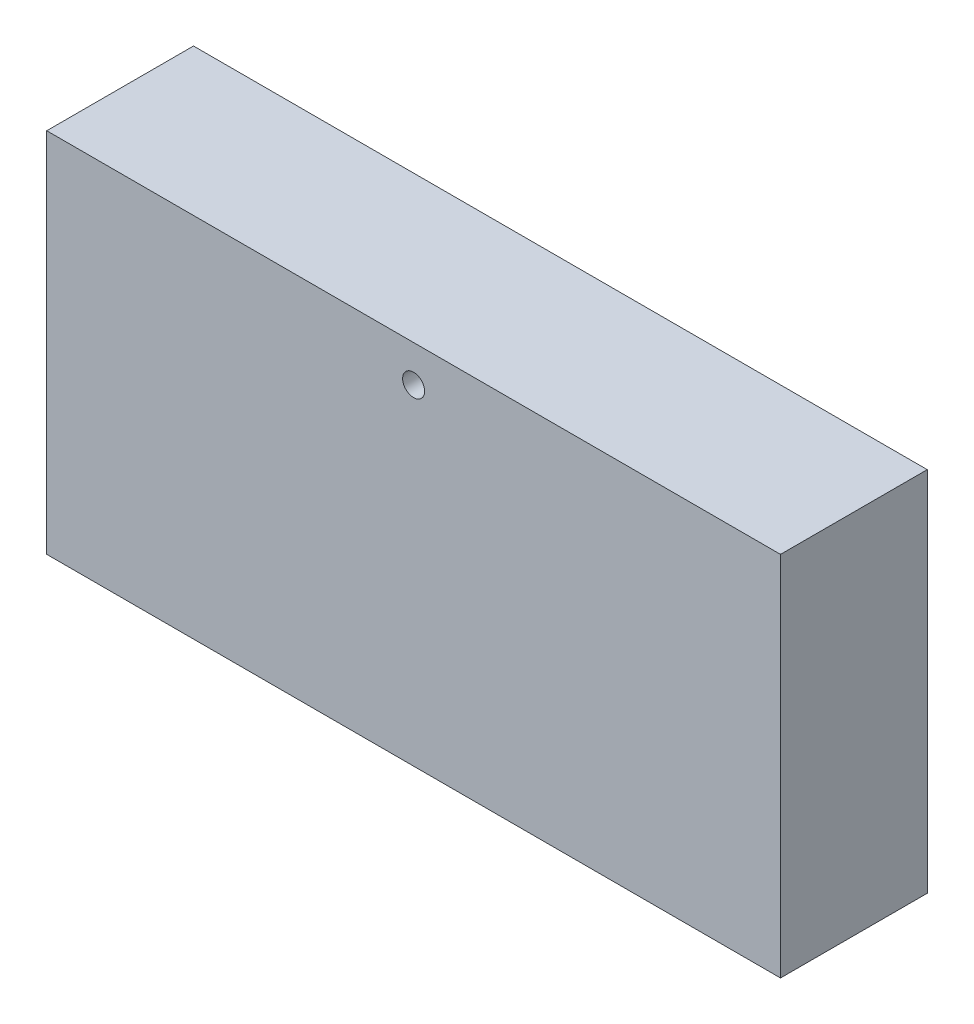
ISO-10303-21;
HEADER;
FILE_DESCRIPTION(('STEP AP214'),'2;1');
FILE_NAME('part.step','',(''),(''),'','','');
FILE_SCHEMA(('AUTOMOTIVE_DESIGN { 1 0 10303 214 1 1 1 1 }'));
ENDSEC;
DATA;
#1=APPLICATION_CONTEXT('core data for automotive mechanical design processes');
#2=APPLICATION_PROTOCOL_DEFINITION('international standard','automotive_design',2000,#1);
#3=PRODUCT_CONTEXT('',#1,'mechanical');
#4=PRODUCT('Part','Part','',(#3));
#5=PRODUCT_RELATED_PRODUCT_CATEGORY('part','',(#4));
#6=PRODUCT_DEFINITION_FORMATION('','',#4);
#7=PRODUCT_DEFINITION_CONTEXT('part definition',#1,'design');
#8=PRODUCT_DEFINITION('design','',#6,#7);
#9=PRODUCT_DEFINITION_SHAPE('','',#8);
#10=(LENGTH_UNIT() NAMED_UNIT(*) SI_UNIT(.MILLI.,.METRE.));
#11=(NAMED_UNIT(*) PLANE_ANGLE_UNIT() SI_UNIT($,.RADIAN.));
#12=(NAMED_UNIT(*) SI_UNIT($,.STERADIAN.) SOLID_ANGLE_UNIT());
#13=UNCERTAINTY_MEASURE_WITH_UNIT(LENGTH_MEASURE(1.E-05),#10,'distance_accuracy_value','');
#14=(GEOMETRIC_REPRESENTATION_CONTEXT(3) GLOBAL_UNCERTAINTY_ASSIGNED_CONTEXT((#13)) GLOBAL_UNIT_ASSIGNED_CONTEXT((#10,
#11,#12)) REPRESENTATION_CONTEXT('',''));
#15=CARTESIAN_POINT('',(0.,0.,0.));
#16=DIRECTION('',(0.,0.,1.));
#17=DIRECTION('',(1.,0.,0.));
#18=AXIS2_PLACEMENT_3D('',#15,#16,#17);
#19=CARTESIAN_POINT('',(0.,0.,20.));
#20=DIRECTION('',(0.,0.,1.));
#21=DIRECTION('',(1.,0.,0.));
#22=AXIS2_PLACEMENT_3D('',#19,#20,#21);
#23=PLANE('',#22);
#24=DIRECTION('',(0.,1.,0.));
#25=VECTOR('',#24,1.);
#26=CARTESIAN_POINT('',(50.,25.,20.));
#27=LINE('',#26,#25);
#28=CARTESIAN_POINT('',(50.,-25.,20.));
#29=VERTEX_POINT('',#28);
#30=CARTESIAN_POINT('',(50.,25.,20.));
#31=VERTEX_POINT('',#30);
#32=EDGE_CURVE('E91',#29,#31,#27,.T.);
#33=ORIENTED_EDGE('',*,*,#32,.T.);
#34=DIRECTION('',(-1.,0.,0.));
#35=VECTOR('',#34,1.);
#36=CARTESIAN_POINT('',(-50.,25.,20.));
#37=LINE('',#36,#35);
#38=CARTESIAN_POINT('',(-50.,25.,20.));
#39=VERTEX_POINT('',#38);
#40=EDGE_CURVE('E86',#31,#39,#37,.T.);
#41=ORIENTED_EDGE('',*,*,#40,.T.);
#42=DIRECTION('',(0.,-1.,0.));
#43=VECTOR('',#42,1.);
#44=CARTESIAN_POINT('',(-50.,25.,20.));
#45=LINE('',#44,#43);
#46=CARTESIAN_POINT('',(-50.,-25.,20.));
#47=VERTEX_POINT('',#46);
#48=EDGE_CURVE('E89',#39,#47,#45,.T.);
#49=ORIENTED_EDGE('',*,*,#48,.T.);
#50=DIRECTION('',(1.,0.,0.));
#51=VECTOR('',#50,1.);
#52=CARTESIAN_POINT('',(-50.,-25.,20.));
#53=LINE('',#52,#51);
#54=EDGE_CURVE('E56',#47,#29,#53,.T.);
#55=ORIENTED_EDGE('',*,*,#54,.T.);
#56=EDGE_LOOP('',(#33,#41,#49,#55));
#57=FACE_BOUND('',#56,.T.);
#58=CARTESIAN_POINT('',(0.,20.,20.));
#59=DIRECTION('',(0.,0.,1.));
#60=DIRECTION('',(1.,0.,0.));
#61=AXIS2_PLACEMENT_3D('',#58,#59,#60);
#62=CIRCLE('',#61,1.5);
#63=CARTESIAN_POINT('',(1.5,20.,20.));
#64=VERTEX_POINT('',#63);
#65=EDGE_CURVE('E106',#64,#64,#62,.T.);
#66=ORIENTED_EDGE('',*,*,#65,.F.);
#67=EDGE_LOOP('',(#66));
#68=FACE_BOUND('',#67,.T.);
#69=ADVANCED_FACE('F39',(#57,#68),#23,.T.);
#70=CARTESIAN_POINT('',(0.,0.,0.));
#71=DIRECTION('',(0.,0.,1.));
#72=DIRECTION('',(1.,0.,0.));
#73=AXIS2_PLACEMENT_3D('',#70,#71,#72);
#74=PLANE('',#73);
#75=DIRECTION('',(0.,1.,0.));
#76=VECTOR('',#75,1.);
#77=CARTESIAN_POINT('',(50.,25.,0.));
#78=LINE('',#77,#76);
#79=CARTESIAN_POINT('',(50.,-25.,0.));
#80=VERTEX_POINT('',#79);
#81=CARTESIAN_POINT('',(50.,25.,0.));
#82=VERTEX_POINT('',#81);
#83=EDGE_CURVE('E103',#80,#82,#78,.T.);
#84=ORIENTED_EDGE('',*,*,#83,.F.);
#85=DIRECTION('',(1.,0.,0.));
#86=VECTOR('',#85,1.);
#87=CARTESIAN_POINT('',(-50.,-25.,0.));
#88=LINE('',#87,#86);
#89=CARTESIAN_POINT('',(-50.,-25.,0.));
#90=VERTEX_POINT('',#89);
#91=EDGE_CURVE('E79',#90,#80,#88,.T.);
#92=ORIENTED_EDGE('',*,*,#91,.F.);
#93=DIRECTION('',(0.,-1.,0.));
#94=VECTOR('',#93,1.);
#95=CARTESIAN_POINT('',(-50.,25.,0.));
#96=LINE('',#95,#94);
#97=CARTESIAN_POINT('',(-50.,25.,0.));
#98=VERTEX_POINT('',#97);
#99=EDGE_CURVE('E73',#98,#90,#96,.T.);
#100=ORIENTED_EDGE('',*,*,#99,.F.);
#101=DIRECTION('',(-1.,0.,0.));
#102=VECTOR('',#101,1.);
#103=CARTESIAN_POINT('',(-50.,25.,0.));
#104=LINE('',#103,#102);
#105=EDGE_CURVE('E95',#82,#98,#104,.T.);
#106=ORIENTED_EDGE('',*,*,#105,.F.);
#107=EDGE_LOOP('',(#84,#92,#100,#106));
#108=FACE_BOUND('',#107,.T.);
#109=CARTESIAN_POINT('',(0.,20.,0.));
#110=DIRECTION('',(0.,0.,1.));
#111=DIRECTION('',(1.,0.,0.));
#112=AXIS2_PLACEMENT_3D('',#109,#110,#111);
#113=CIRCLE('',#112,1.5);
#114=CARTESIAN_POINT('',(1.5,20.,0.));
#115=VERTEX_POINT('',#114);
#116=EDGE_CURVE('E118',#115,#115,#113,.T.);
#117=ORIENTED_EDGE('',*,*,#116,.T.);
#118=EDGE_LOOP('',(#117));
#119=FACE_BOUND('',#118,.T.);
#120=ADVANCED_FACE('F114',(#108,#119),#74,.F.);
#121=CARTESIAN_POINT('',(50.,25.,20.));
#122=DIRECTION('',(-1.,0.,0.));
#123=DIRECTION('',(0.,0.,1.));
#124=AXIS2_PLACEMENT_3D('',#121,#122,#123);
#125=PLANE('',#124);
#126=ORIENTED_EDGE('',*,*,#83,.T.);
#127=DIRECTION('',(0.,0.,-1.));
#128=VECTOR('',#127,1.);
#129=CARTESIAN_POINT('',(50.,25.,20.));
#130=LINE('',#129,#128);
#131=EDGE_CURVE('E11',#31,#82,#130,.T.);
#132=ORIENTED_EDGE('',*,*,#131,.F.);
#133=ORIENTED_EDGE('',*,*,#32,.F.);
#134=DIRECTION('',(0.,0.,-1.));
#135=VECTOR('',#134,1.);
#136=CARTESIAN_POINT('',(50.,-25.,20.));
#137=LINE('',#136,#135);
#138=EDGE_CURVE('E99',#29,#80,#137,.T.);
#139=ORIENTED_EDGE('',*,*,#138,.T.);
#140=EDGE_LOOP('',(#126,#132,#133,#139));
#141=FACE_BOUND('',#140,.T.);
#142=ADVANCED_FACE('F41',(#141),#125,.F.);
#143=CARTESIAN_POINT('',(-50.,25.,20.));
#144=DIRECTION('',(0.,-1.,0.));
#145=DIRECTION('',(0.,0.,-1.));
#146=AXIS2_PLACEMENT_3D('',#143,#144,#145);
#147=PLANE('',#146);
#148=ORIENTED_EDGE('',*,*,#105,.T.);
#149=DIRECTION('',(0.,0.,-1.));
#150=VECTOR('',#149,1.);
#151=CARTESIAN_POINT('',(-50.,25.,20.));
#152=LINE('',#151,#150);
#153=EDGE_CURVE('E48',#39,#98,#152,.T.);
#154=ORIENTED_EDGE('',*,*,#153,.F.);
#155=ORIENTED_EDGE('',*,*,#40,.F.);
#156=ORIENTED_EDGE('',*,*,#131,.T.);
#157=EDGE_LOOP('',(#148,#154,#155,#156));
#158=FACE_BOUND('',#157,.T.);
#159=ADVANCED_FACE('F94',(#158),#147,.F.);
#160=CARTESIAN_POINT('',(-50.,25.,20.));
#161=DIRECTION('',(1.,0.,0.));
#162=DIRECTION('',(0.,1.,0.));
#163=AXIS2_PLACEMENT_3D('',#160,#161,#162);
#164=PLANE('',#163);
#165=ORIENTED_EDGE('',*,*,#99,.T.);
#166=DIRECTION('',(0.,0.,-1.));
#167=VECTOR('',#166,1.);
#168=CARTESIAN_POINT('',(-50.,-25.,20.));
#169=LINE('',#168,#167);
#170=EDGE_CURVE('E96',#47,#90,#169,.T.);
#171=ORIENTED_EDGE('',*,*,#170,.F.);
#172=ORIENTED_EDGE('',*,*,#48,.F.);
#173=ORIENTED_EDGE('',*,*,#153,.T.);
#174=EDGE_LOOP('',(#165,#171,#172,#173));
#175=FACE_BOUND('',#174,.T.);
#176=ADVANCED_FACE('F97',(#175),#164,.F.);
#177=CARTESIAN_POINT('',(-50.,-25.,20.));
#178=DIRECTION('',(0.,1.,0.));
#179=DIRECTION('',(0.,0.,1.));
#180=AXIS2_PLACEMENT_3D('',#177,#178,#179);
#181=PLANE('',#180);
#182=ORIENTED_EDGE('',*,*,#91,.T.);
#183=ORIENTED_EDGE('',*,*,#138,.F.);
#184=ORIENTED_EDGE('',*,*,#54,.F.);
#185=ORIENTED_EDGE('',*,*,#170,.T.);
#186=EDGE_LOOP('',(#182,#183,#184,#185));
#187=FACE_BOUND('',#186,.T.);
#188=ADVANCED_FACE('F111',(#187),#181,.F.);
#189=CARTESIAN_POINT('',(0.,20.,20.));
#190=DIRECTION('',(0.,0.,-1.));
#191=DIRECTION('',(-1.,0.,0.));
#192=AXIS2_PLACEMENT_3D('',#189,#190,#191);
#193=CYLINDRICAL_SURFACE('',#192,1.5);
#194=ORIENTED_EDGE('',*,*,#65,.T.);
#195=EDGE_LOOP('',(#194));
#196=FACE_BOUND('',#195,.T.);
#197=ORIENTED_EDGE('',*,*,#116,.F.);
#198=EDGE_LOOP('',(#197));
#199=FACE_BOUND('',#198,.T.);
#200=ADVANCED_FACE('F124',(#196,#199),#193,.F.);
#201=CLOSED_SHELL('',(#69,#120,#142,#159,#176,#188,#200));
#202=MANIFOLD_SOLID_BREP('B2',#201);
#203=ADVANCED_BREP_SHAPE_REPRESENTATION('',(#18,#202),#14);
#204=SHAPE_DEFINITION_REPRESENTATION(#9,#203);
ENDSEC;
END-ISO-10303-21;
